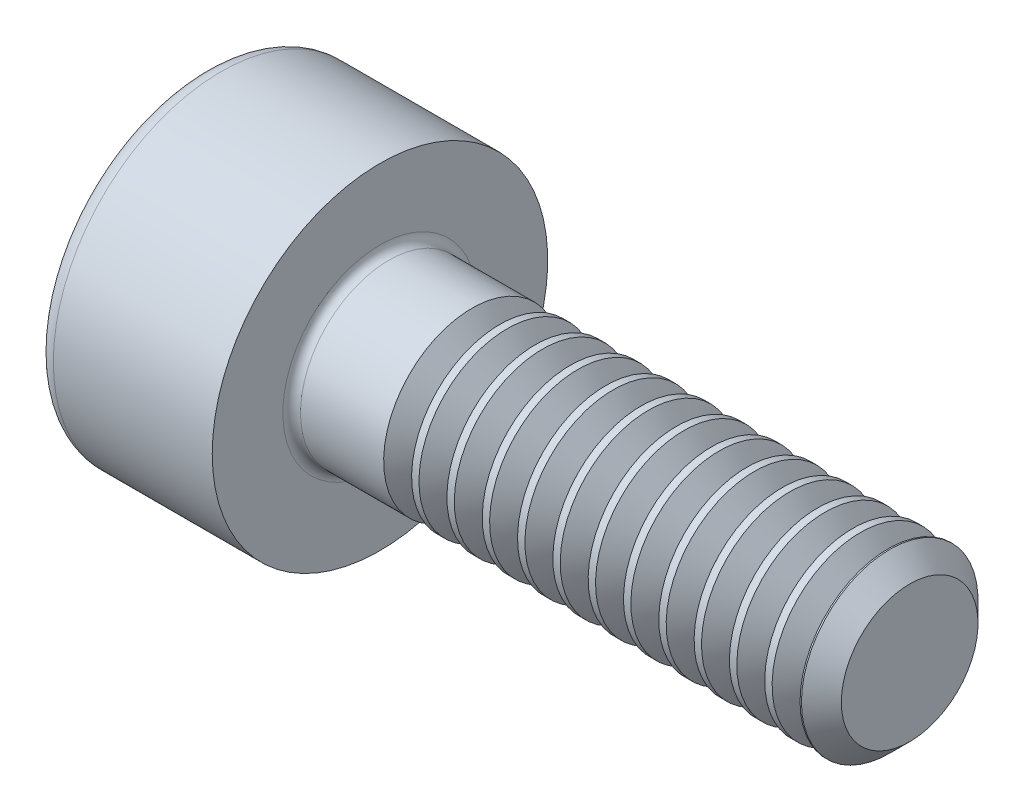
ISO-10303-21;
HEADER;
FILE_DESCRIPTION(('STEP AP214'),'2;1');
FILE_NAME('part.step','',(''),(''),'','','');
FILE_SCHEMA(('AUTOMOTIVE_DESIGN { 1 0 10303 214 1 1 1 1 }'));
ENDSEC;
DATA;
#1=APPLICATION_CONTEXT('core data for automotive mechanical design processes');
#2=APPLICATION_PROTOCOL_DEFINITION('international standard','automotive_design',2000,#1);
#3=PRODUCT_CONTEXT('',#1,'mechanical');
#4=PRODUCT('Part','Part','',(#3));
#5=PRODUCT_RELATED_PRODUCT_CATEGORY('part','',(#4));
#6=PRODUCT_DEFINITION_FORMATION('','',#4);
#7=PRODUCT_DEFINITION_CONTEXT('part definition',#1,'design');
#8=PRODUCT_DEFINITION('design','',#6,#7);
#9=PRODUCT_DEFINITION_SHAPE('','',#8);
#10=(LENGTH_UNIT() NAMED_UNIT(*) SI_UNIT(.MILLI.,.METRE.));
#11=(NAMED_UNIT(*) PLANE_ANGLE_UNIT() SI_UNIT($,.RADIAN.));
#12=(NAMED_UNIT(*) SI_UNIT($,.STERADIAN.) SOLID_ANGLE_UNIT());
#13=UNCERTAINTY_MEASURE_WITH_UNIT(LENGTH_MEASURE(1.E-05),#10,'distance_accuracy_value','');
#14=(GEOMETRIC_REPRESENTATION_CONTEXT(3) GLOBAL_UNCERTAINTY_ASSIGNED_CONTEXT((#13)) GLOBAL_UNIT_ASSIGNED_CONTEXT((#10,
#11,#12)) REPRESENTATION_CONTEXT('',''));
#15=CARTESIAN_POINT('',(0.,0.,0.));
#16=DIRECTION('',(0.,0.,1.));
#17=DIRECTION('',(1.,0.,0.));
#18=AXIS2_PLACEMENT_3D('',#15,#16,#17);
#19=CARTESIAN_POINT('',(0.,0.,0.));
#20=DIRECTION('',(-1.,0.,0.));
#21=DIRECTION('',(0.,0.,1.));
#22=AXIS2_PLACEMENT_3D('',#19,#20,#21);
#23=PLANE('',#22);
#24=DIRECTION('',(0.,-0.499999999999999,0.866025403784439));
#25=VECTOR('',#24,1.);
#26=CARTESIAN_POINT('',(0.,0.877572409168226,0.));
#27=LINE('',#26,#25);
#28=CARTESIAN_POINT('',(0.,0.877572409168226,0.));
#29=VERTEX_POINT('',#28);
#30=CARTESIAN_POINT('',(0.,0.438786204584111,0.759999999999997));
#31=VERTEX_POINT('',#30);
#32=EDGE_CURVE('E444',#29,#31,#27,.T.);
#33=ORIENTED_EDGE('',*,*,#32,.T.);
#34=DIRECTION('',(0.,1.,0.));
#35=VECTOR('',#34,1.);
#36=CARTESIAN_POINT('',(0.,-0.43878620458412,0.759999999999999));
#37=LINE('',#36,#35);
#38=CARTESIAN_POINT('',(0.,-0.43878620458412,0.759999999999999));
#39=VERTEX_POINT('',#38);
#40=EDGE_CURVE('E131',#39,#31,#37,.T.);
#41=ORIENTED_EDGE('',*,*,#40,.F.);
#42=DIRECTION('',(0.,-0.500000000000001,-0.866025403784438));
#43=VECTOR('',#42,1.);
#44=CARTESIAN_POINT('',(0.,-0.43878620458412,0.759999999999999));
#45=LINE('',#44,#43);
#46=CARTESIAN_POINT('',(0.,-0.877572409168237,0.));
#47=VERTEX_POINT('',#46);
#48=EDGE_CURVE('E463',#39,#47,#45,.T.);
#49=ORIENTED_EDGE('',*,*,#48,.T.);
#50=DIRECTION('',(0.,0.499999999999999,-0.866025403784439));
#51=VECTOR('',#50,1.);
#52=CARTESIAN_POINT('',(0.,-0.877572409168237,0.));
#53=LINE('',#52,#51);
#54=CARTESIAN_POINT('',(0.,-0.438786204584122,-0.760000000000002));
#55=VERTEX_POINT('',#54);
#56=EDGE_CURVE('E466',#47,#55,#53,.T.);
#57=ORIENTED_EDGE('',*,*,#56,.T.);
#58=DIRECTION('',(0.,-1.,0.));
#59=VECTOR('',#58,1.);
#60=CARTESIAN_POINT('',(0.,0.43878620458411,-0.760000000000003));
#61=LINE('',#60,#59);
#62=CARTESIAN_POINT('',(0.,0.43878620458411,-0.760000000000003));
#63=VERTEX_POINT('',#62);
#64=EDGE_CURVE('E469',#63,#55,#61,.T.);
#65=ORIENTED_EDGE('',*,*,#64,.F.);
#66=DIRECTION('',(0.,-0.500000000000001,-0.866025403784438));
#67=VECTOR('',#66,1.);
#68=CARTESIAN_POINT('',(0.,0.877572409168226,0.));
#69=LINE('',#68,#67);
#70=EDGE_CURVE('E126',#29,#63,#69,.T.);
#71=ORIENTED_EDGE('',*,*,#70,.F.);
#72=EDGE_LOOP('',(#33,#41,#49,#57,#65,#71));
#73=FACE_BOUND('',#72,.T.);
#74=CARTESIAN_POINT('',(0.,0.,0.));
#75=DIRECTION('',(-1.,0.,0.));
#76=DIRECTION('',(0.,0.,1.));
#77=AXIS2_PLACEMENT_3D('',#74,#75,#76);
#78=CIRCLE('',#77,1.7);
#79=CARTESIAN_POINT('',(0.,0.,1.7));
#80=VERTEX_POINT('',#79);
#81=EDGE_CURVE('E43',#80,#80,#78,.T.);
#82=ORIENTED_EDGE('',*,*,#81,.T.);
#83=EDGE_LOOP('',(#82));
#84=FACE_BOUND('',#83,.T.);
#85=ADVANCED_FACE('F35',(#73,#84),#23,.T.);
#86=CARTESIAN_POINT('',(-31.75,0.,0.));
#87=DIRECTION('',(-1.,0.,0.));
#88=DIRECTION('',(0.,0.,1.));
#89=AXIS2_PLACEMENT_3D('',#86,#87,#88);
#90=CYLINDRICAL_SURFACE('',#89,1.9);
#91=CARTESIAN_POINT('',(0.199999999999999,0.,0.));
#92=DIRECTION('',(-1.,0.,0.));
#93=DIRECTION('',(0.,0.,1.));
#94=AXIS2_PLACEMENT_3D('',#91,#92,#93);
#95=CIRCLE('',#94,1.9);
#96=CARTESIAN_POINT('',(0.199999999999999,0.,1.9));
#97=VERTEX_POINT('',#96);
#98=EDGE_CURVE('E11',#97,#97,#95,.F.);
#99=ORIENTED_EDGE('',*,*,#98,.T.);
#100=EDGE_LOOP('',(#99));
#101=FACE_BOUND('',#100,.T.);
#102=CARTESIAN_POINT('',(2.,0.,0.));
#103=DIRECTION('',(-1.,0.,0.));
#104=DIRECTION('',(0.,0.,1.));
#105=AXIS2_PLACEMENT_3D('',#102,#103,#104);
#106=CIRCLE('',#105,1.9);
#107=CARTESIAN_POINT('',(2.,0.,1.9));
#108=VERTEX_POINT('',#107);
#109=EDGE_CURVE('E149',#108,#108,#106,.T.);
#110=ORIENTED_EDGE('',*,*,#109,.T.);
#111=EDGE_LOOP('',(#110));
#112=FACE_BOUND('',#111,.T.);
#113=ADVANCED_FACE('F173',(#101,#112),#90,.T.);
#114=CARTESIAN_POINT('',(2.,1.9,0.));
#115=DIRECTION('',(1.,0.,0.));
#116=DIRECTION('',(0.,0.,-1.));
#117=AXIS2_PLACEMENT_3D('',#114,#115,#116);
#118=PLANE('',#117);
#119=CARTESIAN_POINT('',(2.,0.,0.));
#120=DIRECTION('',(1.,0.,0.));
#121=DIRECTION('',(0.,0.,-1.));
#122=AXIS2_PLACEMENT_3D('',#119,#120,#121);
#123=CIRCLE('',#122,1.1);
#124=CARTESIAN_POINT('',(2.,0.,-1.1));
#125=VERTEX_POINT('',#124);
#126=EDGE_CURVE('E152',#125,#125,#123,.F.);
#127=ORIENTED_EDGE('',*,*,#126,.T.);
#128=EDGE_LOOP('',(#127));
#129=FACE_BOUND('',#128,.T.);
#130=ORIENTED_EDGE('',*,*,#109,.F.);
#131=EDGE_LOOP('',(#130));
#132=FACE_BOUND('',#131,.T.);
#133=ADVANCED_FACE('F179',(#129,#132),#118,.T.);
#134=CARTESIAN_POINT('',(-31.75,0.,0.));
#135=DIRECTION('',(-1.,0.,0.));
#136=DIRECTION('',(0.,0.,1.));
#137=AXIS2_PLACEMENT_3D('',#134,#135,#136);
#138=CYLINDRICAL_SURFACE('',#137,0.999999999999997);
#139=CARTESIAN_POINT('',(3.0417530963646,0.,0.));
#140=DIRECTION('',(-1.,0.,0.));
#141=DIRECTION('',(0.,-1.,0.));
#142=AXIS2_PLACEMENT_3D('',#139,#140,#141);
#143=CIRCLE('',#142,1.);
#144=CARTESIAN_POINT('',(3.0417530963646,-1.,0.));
#145=VERTEX_POINT('',#144);
#146=EDGE_CURVE('E439',#145,#145,#143,.T.);
#147=ORIENTED_EDGE('',*,*,#146,.T.);
#148=EDGE_LOOP('',(#147));
#149=FACE_BOUND('',#148,.T.);
#150=CARTESIAN_POINT('',(2.1,0.,0.));
#151=DIRECTION('',(1.,0.,0.));
#152=DIRECTION('',(0.,0.,-1.));
#153=AXIS2_PLACEMENT_3D('',#150,#151,#152);
#154=CIRCLE('',#153,0.999999999999997);
#155=CARTESIAN_POINT('',(2.1,0.,-0.999999999999997));
#156=VERTEX_POINT('',#155);
#157=EDGE_CURVE('E155',#156,#156,#154,.T.);
#158=ORIENTED_EDGE('',*,*,#157,.T.);
#159=EDGE_LOOP('',(#158));
#160=FACE_BOUND('',#159,.T.);
#161=ADVANCED_FACE('F169',(#149,#160),#138,.T.);
#162=CARTESIAN_POINT('',(2.1,0.,0.));
#163=DIRECTION('',(1.,0.,0.));
#164=DIRECTION('',(0.,0.,-1.));
#165=AXIS2_PLACEMENT_3D('',#162,#163,#164);
#166=TOROIDAL_SURFACE('',#165,1.1,0.1);
#167=ORIENTED_EDGE('',*,*,#157,.F.);
#168=EDGE_LOOP('',(#167));
#169=FACE_BOUND('',#168,.T.);
#170=ORIENTED_EDGE('',*,*,#126,.F.);
#171=EDGE_LOOP('',(#170));
#172=FACE_BOUND('',#171,.T.);
#173=ADVANCED_FACE('F162',(#169,#172),#166,.F.);
#174=CARTESIAN_POINT('',(0.199999999999999,0.,0.));
#175=DIRECTION('',(-1.,0.,0.));
#176=DIRECTION('',(0.,0.,1.));
#177=AXIS2_PLACEMENT_3D('',#174,#175,#176);
#178=TOROIDAL_SURFACE('',#177,1.7,0.2);
#179=ORIENTED_EDGE('',*,*,#98,.F.);
#180=EDGE_LOOP('',(#179));
#181=FACE_BOUND('',#180,.T.);
#182=ORIENTED_EDGE('',*,*,#81,.F.);
#183=EDGE_LOOP('',(#182));
#184=FACE_BOUND('',#183,.T.);
#185=ADVANCED_FACE('F37',(#181,#184),#178,.T.);
#186=CARTESIAN_POINT('',(1.,0.877572409168226,0.));
#187=DIRECTION('',(0.,-0.866025403784439,-0.499999999999999));
#188=DIRECTION('',(0.,0.499999999999999,-0.866025403784439));
#189=AXIS2_PLACEMENT_3D('',#186,#187,#188);
#190=PLANE('',#189);
#191=ORIENTED_EDGE('',*,*,#32,.F.);
#192=DIRECTION('',(-1.,0.,0.));
#193=VECTOR('',#192,1.);
#194=CARTESIAN_POINT('',(1.,0.877572409168226,0.));
#195=LINE('',#194,#193);
#196=CARTESIAN_POINT('',(1.,0.877572409168226,0.));
#197=VERTEX_POINT('',#196);
#198=EDGE_CURVE('E460',#197,#29,#195,.T.);
#199=ORIENTED_EDGE('',*,*,#198,.F.);
#200=DIRECTION('',(0.,-0.499999999999999,0.866025403784439));
#201=VECTOR('',#200,1.);
#202=CARTESIAN_POINT('',(1.,0.877572409168226,0.));
#203=LINE('',#202,#201);
#204=CARTESIAN_POINT('',(1.,0.658179306876169,0.379999999999997));
#205=VERTEX_POINT('',#204);
#206=EDGE_CURVE('E118',#197,#205,#203,.T.);
#207=ORIENTED_EDGE('',*,*,#206,.T.);
#208=CARTESIAN_POINT('',(1.,0.438786204584111,0.759999999999997));
#209=VERTEX_POINT('',#208);
#210=EDGE_CURVE('E109',#205,#209,#203,.T.);
#211=ORIENTED_EDGE('',*,*,#210,.T.);
#212=DIRECTION('',(-1.,0.,0.));
#213=VECTOR('',#212,1.);
#214=CARTESIAN_POINT('',(1.,0.438786204584111,0.759999999999997));
#215=LINE('',#214,#213);
#216=EDGE_CURVE('E123',#209,#31,#215,.T.);
#217=ORIENTED_EDGE('',*,*,#216,.T.);
#218=EDGE_LOOP('',(#191,#199,#207,#211,#217));
#219=FACE_BOUND('',#218,.T.);
#220=ADVANCED_FACE('F122',(#219),#190,.T.);
#221=CARTESIAN_POINT('',(1.,-0.43878620458412,0.759999999999999));
#222=DIRECTION('',(0.,0.,1.));
#223=DIRECTION('',(0.,-1.,0.));
#224=AXIS2_PLACEMENT_3D('',#221,#222,#223);
#225=PLANE('',#224);
#226=ORIENTED_EDGE('',*,*,#40,.T.);
#227=ORIENTED_EDGE('',*,*,#216,.F.);
#228=DIRECTION('',(0.,1.,0.));
#229=VECTOR('',#228,1.);
#230=CARTESIAN_POINT('',(1.,-0.43878620458412,0.759999999999999));
#231=LINE('',#230,#229);
#232=CARTESIAN_POINT('',(1.,0.,0.759999999999998));
#233=VERTEX_POINT('',#232);
#234=EDGE_CURVE('E106',#233,#209,#231,.T.);
#235=ORIENTED_EDGE('',*,*,#234,.F.);
#236=CARTESIAN_POINT('',(1.,-0.43878620458412,0.759999999999999));
#237=VERTEX_POINT('',#236);
#238=EDGE_CURVE('E117',#237,#233,#231,.T.);
#239=ORIENTED_EDGE('',*,*,#238,.F.);
#240=DIRECTION('',(-1.,0.,0.));
#241=VECTOR('',#240,1.);
#242=CARTESIAN_POINT('',(1.,-0.43878620458412,0.759999999999999));
#243=LINE('',#242,#241);
#244=EDGE_CURVE('E133',#237,#39,#243,.T.);
#245=ORIENTED_EDGE('',*,*,#244,.T.);
#246=EDGE_LOOP('',(#226,#227,#235,#239,#245));
#247=FACE_BOUND('',#246,.T.);
#248=ADVANCED_FACE('F128',(#247),#225,.F.);
#249=CARTESIAN_POINT('',(1.,-0.43878620458412,0.759999999999999));
#250=DIRECTION('',(0.,0.866025403784438,-0.500000000000001));
#251=DIRECTION('',(0.,0.500000000000001,0.866025403784438));
#252=AXIS2_PLACEMENT_3D('',#249,#250,#251);
#253=PLANE('',#252);
#254=ORIENTED_EDGE('',*,*,#48,.F.);
#255=ORIENTED_EDGE('',*,*,#244,.F.);
#256=DIRECTION('',(0.,-0.500000000000001,-0.866025403784438));
#257=VECTOR('',#256,1.);
#258=CARTESIAN_POINT('',(1.,-0.43878620458412,0.759999999999999));
#259=LINE('',#258,#257);
#260=CARTESIAN_POINT('',(1.,-0.658179306876176,0.380000000000003));
#261=VERTEX_POINT('',#260);
#262=EDGE_CURVE('E447',#237,#261,#259,.T.);
#263=ORIENTED_EDGE('',*,*,#262,.T.);
#264=CARTESIAN_POINT('',(1.,-0.877572409168237,0.));
#265=VERTEX_POINT('',#264);
#266=EDGE_CURVE('E446',#261,#265,#259,.T.);
#267=ORIENTED_EDGE('',*,*,#266,.T.);
#268=DIRECTION('',(-1.,0.,0.));
#269=VECTOR('',#268,1.);
#270=CARTESIAN_POINT('',(1.,-0.877572409168237,0.));
#271=LINE('',#270,#269);
#272=EDGE_CURVE('E138',#265,#47,#271,.T.);
#273=ORIENTED_EDGE('',*,*,#272,.T.);
#274=EDGE_LOOP('',(#254,#255,#263,#267,#273));
#275=FACE_BOUND('',#274,.T.);
#276=ADVANCED_FACE('F207',(#275),#253,.T.);
#277=CARTESIAN_POINT('',(1.,-0.877572409168237,0.));
#278=DIRECTION('',(0.,0.866025403784439,0.499999999999999));
#279=DIRECTION('',(0.,-0.499999999999999,0.866025403784439));
#280=AXIS2_PLACEMENT_3D('',#277,#278,#279);
#281=PLANE('',#280);
#282=ORIENTED_EDGE('',*,*,#56,.F.);
#283=ORIENTED_EDGE('',*,*,#272,.F.);
#284=DIRECTION('',(0.,0.499999999999999,-0.866025403784439));
#285=VECTOR('',#284,1.);
#286=CARTESIAN_POINT('',(1.,-0.877572409168237,0.));
#287=LINE('',#286,#285);
#288=CARTESIAN_POINT('',(1.,-0.658179306876179,-0.380000000000002));
#289=VERTEX_POINT('',#288);
#290=EDGE_CURVE('E451',#265,#289,#287,.T.);
#291=ORIENTED_EDGE('',*,*,#290,.T.);
#292=CARTESIAN_POINT('',(1.,-0.438786204584122,-0.760000000000002));
#293=VERTEX_POINT('',#292);
#294=EDGE_CURVE('E450',#289,#293,#287,.T.);
#295=ORIENTED_EDGE('',*,*,#294,.T.);
#296=DIRECTION('',(-1.,0.,0.));
#297=VECTOR('',#296,1.);
#298=CARTESIAN_POINT('',(1.,-0.438786204584122,-0.760000000000002));
#299=LINE('',#298,#297);
#300=EDGE_CURVE('E478',#293,#55,#299,.T.);
#301=ORIENTED_EDGE('',*,*,#300,.T.);
#302=EDGE_LOOP('',(#282,#283,#291,#295,#301));
#303=FACE_BOUND('',#302,.T.);
#304=ADVANCED_FACE('F210',(#303),#281,.T.);
#305=CARTESIAN_POINT('',(1.,0.43878620458411,-0.760000000000003));
#306=DIRECTION('',(0.,0.,-1.));
#307=DIRECTION('',(0.,1.,0.));
#308=AXIS2_PLACEMENT_3D('',#305,#306,#307);
#309=PLANE('',#308);
#310=ORIENTED_EDGE('',*,*,#64,.T.);
#311=ORIENTED_EDGE('',*,*,#300,.F.);
#312=DIRECTION('',(0.,-1.,0.));
#313=VECTOR('',#312,1.);
#314=CARTESIAN_POINT('',(1.,0.43878620458411,-0.760000000000003));
#315=LINE('',#314,#313);
#316=CARTESIAN_POINT('',(1.,0.,-0.76));
#317=VERTEX_POINT('',#316);
#318=EDGE_CURVE('E454',#317,#293,#315,.T.);
#319=ORIENTED_EDGE('',*,*,#318,.F.);
#320=CARTESIAN_POINT('',(1.,0.43878620458411,-0.760000000000003));
#321=VERTEX_POINT('',#320);
#322=EDGE_CURVE('E50',#321,#317,#315,.T.);
#323=ORIENTED_EDGE('',*,*,#322,.F.);
#324=DIRECTION('',(-1.,0.,0.));
#325=VECTOR('',#324,1.);
#326=CARTESIAN_POINT('',(1.,0.43878620458411,-0.760000000000003));
#327=LINE('',#326,#325);
#328=EDGE_CURVE('E475',#321,#63,#327,.T.);
#329=ORIENTED_EDGE('',*,*,#328,.T.);
#330=EDGE_LOOP('',(#310,#311,#319,#323,#329));
#331=FACE_BOUND('',#330,.T.);
#332=ADVANCED_FACE('F214',(#331),#309,.F.);
#333=CARTESIAN_POINT('',(1.,0.877572409168226,0.));
#334=DIRECTION('',(0.,0.866025403784438,-0.500000000000001));
#335=DIRECTION('',(0.,0.500000000000001,0.866025403784438));
#336=AXIS2_PLACEMENT_3D('',#333,#334,#335);
#337=PLANE('',#336);
#338=ORIENTED_EDGE('',*,*,#70,.T.);
#339=ORIENTED_EDGE('',*,*,#328,.F.);
#340=DIRECTION('',(0.,-0.500000000000001,-0.866025403784438));
#341=VECTOR('',#340,1.);
#342=CARTESIAN_POINT('',(1.,0.877572409168226,0.));
#343=LINE('',#342,#341);
#344=CARTESIAN_POINT('',(1.,0.65817930687617,-0.379999999999999));
#345=VERTEX_POINT('',#344);
#346=EDGE_CURVE('E456',#345,#321,#343,.T.);
#347=ORIENTED_EDGE('',*,*,#346,.F.);
#348=EDGE_CURVE('E457',#197,#345,#343,.T.);
#349=ORIENTED_EDGE('',*,*,#348,.F.);
#350=ORIENTED_EDGE('',*,*,#198,.T.);
#351=EDGE_LOOP('',(#338,#339,#347,#349,#350));
#352=FACE_BOUND('',#351,.T.);
#353=ADVANCED_FACE('F218',(#352),#337,.F.);
#354=CARTESIAN_POINT('',(1.,0.,1.52));
#355=DIRECTION('',(1.,0.,0.));
#356=DIRECTION('',(0.,0.,-1.));
#357=AXIS2_PLACEMENT_3D('',#354,#355,#356);
#358=PLANE('',#357);
#359=ORIENTED_EDGE('',*,*,#318,.T.);
#360=ORIENTED_EDGE('',*,*,#294,.F.);
#361=CARTESIAN_POINT('',(1.,0.,0.));
#362=DIRECTION('',(-1.,0.,0.));
#363=DIRECTION('',(0.,0.,1.));
#364=AXIS2_PLACEMENT_3D('',#361,#362,#363);
#365=CIRCLE('',#364,0.76);
#366=EDGE_CURVE('E495',#317,#289,#365,.T.);
#367=ORIENTED_EDGE('',*,*,#366,.F.);
#368=EDGE_LOOP('',(#359,#360,#367));
#369=FACE_BOUND('',#368,.T.);
#370=ADVANCED_FACE('F222',(#369),#358,.F.);
#371=ORIENTED_EDGE('',*,*,#290,.F.);
#372=ORIENTED_EDGE('',*,*,#266,.F.);
#373=EDGE_CURVE('E136',#289,#261,#365,.T.);
#374=ORIENTED_EDGE('',*,*,#373,.F.);
#375=EDGE_LOOP('',(#371,#372,#374));
#376=FACE_BOUND('',#375,.T.);
#377=ADVANCED_FACE('F226',(#376),#358,.F.);
#378=ORIENTED_EDGE('',*,*,#262,.F.);
#379=ORIENTED_EDGE('',*,*,#238,.T.);
#380=EDGE_CURVE('E132',#261,#233,#365,.T.);
#381=ORIENTED_EDGE('',*,*,#380,.F.);
#382=EDGE_LOOP('',(#378,#379,#381));
#383=FACE_BOUND('',#382,.T.);
#384=ADVANCED_FACE('F504',(#383),#358,.F.);
#385=ORIENTED_EDGE('',*,*,#234,.T.);
#386=ORIENTED_EDGE('',*,*,#210,.F.);
#387=EDGE_CURVE('E112',#233,#205,#365,.T.);
#388=ORIENTED_EDGE('',*,*,#387,.F.);
#389=EDGE_LOOP('',(#385,#386,#388));
#390=FACE_BOUND('',#389,.T.);
#391=ADVANCED_FACE('F108',(#390),#358,.F.);
#392=ORIENTED_EDGE('',*,*,#206,.F.);
#393=ORIENTED_EDGE('',*,*,#348,.T.);
#394=EDGE_CURVE('E143',#205,#345,#365,.T.);
#395=ORIENTED_EDGE('',*,*,#394,.F.);
#396=EDGE_LOOP('',(#392,#393,#395));
#397=FACE_BOUND('',#396,.T.);
#398=ADVANCED_FACE('F490',(#397),#358,.F.);
#399=ORIENTED_EDGE('',*,*,#346,.T.);
#400=ORIENTED_EDGE('',*,*,#322,.T.);
#401=EDGE_CURVE('E494',#345,#317,#365,.T.);
#402=ORIENTED_EDGE('',*,*,#401,.F.);
#403=EDGE_LOOP('',(#399,#400,#402));
#404=FACE_BOUND('',#403,.T.);
#405=ADVANCED_FACE('F203',(#404),#358,.F.);
#406=CARTESIAN_POINT('',(1.,0.,0.));
#407=DIRECTION('',(-1.,0.,0.));
#408=DIRECTION('',(0.,0.,1.));
#409=AXIS2_PLACEMENT_3D('',#406,#407,#408);
#410=CONICAL_SURFACE('',#409,0.76,1.0471975511966);
#411=CARTESIAN_POINT('',(1.43878620458412,0.,0.));
#412=VERTEX_POINT('',#411);
#413=VERTEX_LOOP('',#412);
#414=FACE_BOUND('',#413,.T.);
#415=ORIENTED_EDGE('',*,*,#387,.T.);
#416=ORIENTED_EDGE('',*,*,#394,.T.);
#417=ORIENTED_EDGE('',*,*,#401,.T.);
#418=ORIENTED_EDGE('',*,*,#366,.T.);
#419=ORIENTED_EDGE('',*,*,#373,.T.);
#420=ORIENTED_EDGE('',*,*,#380,.T.);
#421=EDGE_LOOP('',(#415,#416,#417,#418,#419,#420));
#422=FACE_BOUND('',#421,.T.);
#423=ADVANCED_FACE('F200',(#414,#422),#410,.F.);
#424=CARTESIAN_POINT('',(3.35824690363539,0.,0.));
#425=DIRECTION('',(1.,0.,0.));
#426=DIRECTION('',(0.,1.,0.));
#427=AXIS2_PLACEMENT_3D('',#424,#425,#426);
#428=CONICAL_SURFACE('',#427,1.,0.959931088596883);
#429=CARTESIAN_POINT('',(3.2,0.,0.));
#430=DIRECTION('',(-1.,0.,0.));
#431=DIRECTION('',(0.,-1.,0.));
#432=AXIS2_PLACEMENT_3D('',#429,#430,#431);
#433=CIRCLE('',#432,0.774000000000001);
#434=CARTESIAN_POINT('',(3.2,-0.774,0.));
#435=VERTEX_POINT('',#434);
#436=EDGE_CURVE('E436',#435,#435,#433,.T.);
#437=ORIENTED_EDGE('',*,*,#436,.F.);
#438=EDGE_LOOP('',(#437));
#439=FACE_BOUND('',#438,.T.);
#440=CARTESIAN_POINT('',(3.35824690363539,0.,0.));
#441=DIRECTION('',(-1.,0.,0.));
#442=DIRECTION('',(0.,-1.,0.));
#443=AXIS2_PLACEMENT_3D('',#440,#441,#442);
#444=CIRCLE('',#443,1.);
#445=CARTESIAN_POINT('',(3.35824690363539,-1.,0.));
#446=VERTEX_POINT('',#445);
#447=EDGE_CURVE('E442',#446,#446,#444,.T.);
#448=ORIENTED_EDGE('',*,*,#447,.T.);
#449=EDGE_LOOP('',(#448));
#450=FACE_BOUND('',#449,.T.);
#451=ADVANCED_FACE('F202',(#439,#450),#428,.T.);
#452=CARTESIAN_POINT('',(3.2,0.,0.));
#453=DIRECTION('',(-1.,0.,0.));
#454=DIRECTION('',(0.,-1.,0.));
#455=AXIS2_PLACEMENT_3D('',#452,#453,#454);
#456=CONICAL_SURFACE('',#455,0.774000000000001,0.959931088596878);
#457=ORIENTED_EDGE('',*,*,#146,.F.);
#458=EDGE_LOOP('',(#457));
#459=FACE_BOUND('',#458,.T.);
#460=ORIENTED_EDGE('',*,*,#436,.T.);
#461=EDGE_LOOP('',(#460));
#462=FACE_BOUND('',#461,.T.);
#463=ADVANCED_FACE('F230',(#459,#462),#456,.T.);
#464=CARTESIAN_POINT('',(3.4417530963646,0.,0.));
#465=DIRECTION('',(-1.,0.,0.));
#466=DIRECTION('',(0.,-1.,0.));
#467=AXIS2_PLACEMENT_3D('',#464,#465,#466);
#468=CIRCLE('',#467,1.);
#469=CARTESIAN_POINT('',(3.4417530963646,-1.,0.));
#470=VERTEX_POINT('',#469);
#471=EDGE_CURVE('E430',#470,#470,#468,.T.);
#472=ORIENTED_EDGE('',*,*,#471,.T.);
#473=EDGE_LOOP('',(#472));
#474=FACE_BOUND('',#473,.T.);
#475=ORIENTED_EDGE('',*,*,#447,.F.);
#476=EDGE_LOOP('',(#475));
#477=FACE_BOUND('',#476,.T.);
#478=ADVANCED_FACE('F190',(#474,#477),#138,.T.);
#479=CARTESIAN_POINT('',(3.75824690363539,0.,0.));
#480=DIRECTION('',(1.,0.,0.));
#481=DIRECTION('',(0.,1.,0.));
#482=AXIS2_PLACEMENT_3D('',#479,#480,#481);
#483=CONICAL_SURFACE('',#482,1.,0.959931088596883);
#484=CARTESIAN_POINT('',(3.6,0.,0.));
#485=DIRECTION('',(-1.,0.,0.));
#486=DIRECTION('',(0.,-1.,0.));
#487=AXIS2_PLACEMENT_3D('',#484,#485,#486);
#488=CIRCLE('',#487,0.774000000000001);
#489=CARTESIAN_POINT('',(3.6,-0.774,0.));
#490=VERTEX_POINT('',#489);
#491=EDGE_CURVE('E427',#490,#490,#488,.T.);
#492=ORIENTED_EDGE('',*,*,#491,.F.);
#493=EDGE_LOOP('',(#492));
#494=FACE_BOUND('',#493,.T.);
#495=CARTESIAN_POINT('',(3.75824690363539,0.,0.));
#496=DIRECTION('',(-1.,0.,0.));
#497=DIRECTION('',(0.,-1.,0.));
#498=AXIS2_PLACEMENT_3D('',#495,#496,#497);
#499=CIRCLE('',#498,1.);
#500=CARTESIAN_POINT('',(3.75824690363539,-1.,0.));
#501=VERTEX_POINT('',#500);
#502=EDGE_CURVE('E433',#501,#501,#499,.T.);
#503=ORIENTED_EDGE('',*,*,#502,.T.);
#504=EDGE_LOOP('',(#503));
#505=FACE_BOUND('',#504,.T.);
#506=ADVANCED_FACE('F235',(#494,#505),#483,.T.);
#507=CARTESIAN_POINT('',(3.6,0.,0.));
#508=DIRECTION('',(-1.,0.,0.));
#509=DIRECTION('',(0.,-1.,0.));
#510=AXIS2_PLACEMENT_3D('',#507,#508,#509);
#511=CONICAL_SURFACE('',#510,0.774000000000001,0.959931088596878);
#512=ORIENTED_EDGE('',*,*,#471,.F.);
#513=EDGE_LOOP('',(#512));
#514=FACE_BOUND('',#513,.T.);
#515=ORIENTED_EDGE('',*,*,#491,.T.);
#516=EDGE_LOOP('',(#515));
#517=FACE_BOUND('',#516,.T.);
#518=ADVANCED_FACE('F238',(#514,#517),#511,.T.);
#519=CARTESIAN_POINT('',(3.8417530963646,0.,0.));
#520=DIRECTION('',(-1.,0.,0.));
#521=DIRECTION('',(0.,-1.,0.));
#522=AXIS2_PLACEMENT_3D('',#519,#520,#521);
#523=CIRCLE('',#522,1.);
#524=CARTESIAN_POINT('',(3.8417530963646,-1.,0.));
#525=VERTEX_POINT('',#524);
#526=EDGE_CURVE('E421',#525,#525,#523,.T.);
#527=ORIENTED_EDGE('',*,*,#526,.T.);
#528=EDGE_LOOP('',(#527));
#529=FACE_BOUND('',#528,.T.);
#530=ORIENTED_EDGE('',*,*,#502,.F.);
#531=EDGE_LOOP('',(#530));
#532=FACE_BOUND('',#531,.T.);
#533=ADVANCED_FACE('F242',(#529,#532),#138,.T.);
#534=CARTESIAN_POINT('',(4.15824690363539,0.,0.));
#535=DIRECTION('',(1.,0.,0.));
#536=DIRECTION('',(0.,1.,0.));
#537=AXIS2_PLACEMENT_3D('',#534,#535,#536);
#538=CONICAL_SURFACE('',#537,1.,0.959931088596883);
#539=CARTESIAN_POINT('',(4.,0.,0.));
#540=DIRECTION('',(-1.,0.,0.));
#541=DIRECTION('',(0.,-1.,0.));
#542=AXIS2_PLACEMENT_3D('',#539,#540,#541);
#543=CIRCLE('',#542,0.774000000000001);
#544=CARTESIAN_POINT('',(4.,-0.774,0.));
#545=VERTEX_POINT('',#544);
#546=EDGE_CURVE('E418',#545,#545,#543,.T.);
#547=ORIENTED_EDGE('',*,*,#546,.F.);
#548=EDGE_LOOP('',(#547));
#549=FACE_BOUND('',#548,.T.);
#550=CARTESIAN_POINT('',(4.15824690363539,0.,0.));
#551=DIRECTION('',(-1.,0.,0.));
#552=DIRECTION('',(0.,-1.,0.));
#553=AXIS2_PLACEMENT_3D('',#550,#551,#552);
#554=CIRCLE('',#553,1.);
#555=CARTESIAN_POINT('',(4.15824690363539,-1.,0.));
#556=VERTEX_POINT('',#555);
#557=EDGE_CURVE('E424',#556,#556,#554,.T.);
#558=ORIENTED_EDGE('',*,*,#557,.T.);
#559=EDGE_LOOP('',(#558));
#560=FACE_BOUND('',#559,.T.);
#561=ADVANCED_FACE('F244',(#549,#560),#538,.T.);
#562=CARTESIAN_POINT('',(4.,0.,0.));
#563=DIRECTION('',(-1.,0.,0.));
#564=DIRECTION('',(0.,-1.,0.));
#565=AXIS2_PLACEMENT_3D('',#562,#563,#564);
#566=CONICAL_SURFACE('',#565,0.774000000000001,0.959931088596878);
#567=ORIENTED_EDGE('',*,*,#526,.F.);
#568=EDGE_LOOP('',(#567));
#569=FACE_BOUND('',#568,.T.);
#570=ORIENTED_EDGE('',*,*,#546,.T.);
#571=EDGE_LOOP('',(#570));
#572=FACE_BOUND('',#571,.T.);
#573=ADVANCED_FACE('F247',(#569,#572),#566,.T.);
#574=CARTESIAN_POINT('',(4.2417530963646,0.,0.));
#575=DIRECTION('',(-1.,0.,0.));
#576=DIRECTION('',(0.,-1.,0.));
#577=AXIS2_PLACEMENT_3D('',#574,#575,#576);
#578=CIRCLE('',#577,1.);
#579=CARTESIAN_POINT('',(4.2417530963646,-1.,0.));
#580=VERTEX_POINT('',#579);
#581=EDGE_CURVE('E412',#580,#580,#578,.T.);
#582=ORIENTED_EDGE('',*,*,#581,.T.);
#583=EDGE_LOOP('',(#582));
#584=FACE_BOUND('',#583,.T.);
#585=ORIENTED_EDGE('',*,*,#557,.F.);
#586=EDGE_LOOP('',(#585));
#587=FACE_BOUND('',#586,.T.);
#588=ADVANCED_FACE('F251',(#584,#587),#138,.T.);
#589=CARTESIAN_POINT('',(4.55824690363539,0.,0.));
#590=DIRECTION('',(1.,0.,0.));
#591=DIRECTION('',(0.,1.,0.));
#592=AXIS2_PLACEMENT_3D('',#589,#590,#591);
#593=CONICAL_SURFACE('',#592,1.,0.959931088596883);
#594=CARTESIAN_POINT('',(4.4,0.,0.));
#595=DIRECTION('',(-1.,0.,0.));
#596=DIRECTION('',(0.,-1.,0.));
#597=AXIS2_PLACEMENT_3D('',#594,#595,#596);
#598=CIRCLE('',#597,0.774000000000001);
#599=CARTESIAN_POINT('',(4.4,-0.774,0.));
#600=VERTEX_POINT('',#599);
#601=EDGE_CURVE('E409',#600,#600,#598,.T.);
#602=ORIENTED_EDGE('',*,*,#601,.F.);
#603=EDGE_LOOP('',(#602));
#604=FACE_BOUND('',#603,.T.);
#605=CARTESIAN_POINT('',(4.55824690363539,0.,0.));
#606=DIRECTION('',(-1.,0.,0.));
#607=DIRECTION('',(0.,-1.,0.));
#608=AXIS2_PLACEMENT_3D('',#605,#606,#607);
#609=CIRCLE('',#608,1.);
#610=CARTESIAN_POINT('',(4.55824690363539,-1.,0.));
#611=VERTEX_POINT('',#610);
#612=EDGE_CURVE('E415',#611,#611,#609,.T.);
#613=ORIENTED_EDGE('',*,*,#612,.T.);
#614=EDGE_LOOP('',(#613));
#615=FACE_BOUND('',#614,.T.);
#616=ADVANCED_FACE('F253',(#604,#615),#593,.T.);
#617=CARTESIAN_POINT('',(4.4,0.,0.));
#618=DIRECTION('',(-1.,0.,0.));
#619=DIRECTION('',(0.,-1.,0.));
#620=AXIS2_PLACEMENT_3D('',#617,#618,#619);
#621=CONICAL_SURFACE('',#620,0.774000000000001,0.959931088596878);
#622=ORIENTED_EDGE('',*,*,#581,.F.);
#623=EDGE_LOOP('',(#622));
#624=FACE_BOUND('',#623,.T.);
#625=ORIENTED_EDGE('',*,*,#601,.T.);
#626=EDGE_LOOP('',(#625));
#627=FACE_BOUND('',#626,.T.);
#628=ADVANCED_FACE('F256',(#624,#627),#621,.T.);
#629=CARTESIAN_POINT('',(4.6417530963646,0.,0.));
#630=DIRECTION('',(-1.,0.,0.));
#631=DIRECTION('',(0.,-1.,0.));
#632=AXIS2_PLACEMENT_3D('',#629,#630,#631);
#633=CIRCLE('',#632,1.);
#634=CARTESIAN_POINT('',(4.6417530963646,-1.,0.));
#635=VERTEX_POINT('',#634);
#636=EDGE_CURVE('E403',#635,#635,#633,.T.);
#637=ORIENTED_EDGE('',*,*,#636,.T.);
#638=EDGE_LOOP('',(#637));
#639=FACE_BOUND('',#638,.T.);
#640=ORIENTED_EDGE('',*,*,#612,.F.);
#641=EDGE_LOOP('',(#640));
#642=FACE_BOUND('',#641,.T.);
#643=ADVANCED_FACE('F260',(#639,#642),#138,.T.);
#644=CARTESIAN_POINT('',(4.95824690363539,0.,0.));
#645=DIRECTION('',(1.,0.,0.));
#646=DIRECTION('',(0.,1.,0.));
#647=AXIS2_PLACEMENT_3D('',#644,#645,#646);
#648=CONICAL_SURFACE('',#647,1.,0.959931088596883);
#649=CARTESIAN_POINT('',(4.8,0.,0.));
#650=DIRECTION('',(-1.,0.,0.));
#651=DIRECTION('',(0.,-1.,0.));
#652=AXIS2_PLACEMENT_3D('',#649,#650,#651);
#653=CIRCLE('',#652,0.774000000000001);
#654=CARTESIAN_POINT('',(4.8,-0.774,0.));
#655=VERTEX_POINT('',#654);
#656=EDGE_CURVE('E400',#655,#655,#653,.T.);
#657=ORIENTED_EDGE('',*,*,#656,.F.);
#658=EDGE_LOOP('',(#657));
#659=FACE_BOUND('',#658,.T.);
#660=CARTESIAN_POINT('',(4.95824690363539,0.,0.));
#661=DIRECTION('',(-1.,0.,0.));
#662=DIRECTION('',(0.,-1.,0.));
#663=AXIS2_PLACEMENT_3D('',#660,#661,#662);
#664=CIRCLE('',#663,1.);
#665=CARTESIAN_POINT('',(4.95824690363539,-1.,0.));
#666=VERTEX_POINT('',#665);
#667=EDGE_CURVE('E406',#666,#666,#664,.T.);
#668=ORIENTED_EDGE('',*,*,#667,.T.);
#669=EDGE_LOOP('',(#668));
#670=FACE_BOUND('',#669,.T.);
#671=ADVANCED_FACE('F262',(#659,#670),#648,.T.);
#672=CARTESIAN_POINT('',(4.8,0.,0.));
#673=DIRECTION('',(-1.,0.,0.));
#674=DIRECTION('',(0.,-1.,0.));
#675=AXIS2_PLACEMENT_3D('',#672,#673,#674);
#676=CONICAL_SURFACE('',#675,0.774000000000001,0.959931088596878);
#677=ORIENTED_EDGE('',*,*,#636,.F.);
#678=EDGE_LOOP('',(#677));
#679=FACE_BOUND('',#678,.T.);
#680=ORIENTED_EDGE('',*,*,#656,.T.);
#681=EDGE_LOOP('',(#680));
#682=FACE_BOUND('',#681,.T.);
#683=ADVANCED_FACE('F265',(#679,#682),#676,.T.);
#684=CARTESIAN_POINT('',(5.0417530963646,0.,0.));
#685=DIRECTION('',(-1.,0.,0.));
#686=DIRECTION('',(0.,-1.,0.));
#687=AXIS2_PLACEMENT_3D('',#684,#685,#686);
#688=CIRCLE('',#687,1.);
#689=CARTESIAN_POINT('',(5.0417530963646,-1.,0.));
#690=VERTEX_POINT('',#689);
#691=EDGE_CURVE('E394',#690,#690,#688,.T.);
#692=ORIENTED_EDGE('',*,*,#691,.T.);
#693=EDGE_LOOP('',(#692));
#694=FACE_BOUND('',#693,.T.);
#695=ORIENTED_EDGE('',*,*,#667,.F.);
#696=EDGE_LOOP('',(#695));
#697=FACE_BOUND('',#696,.T.);
#698=ADVANCED_FACE('F269',(#694,#697),#138,.T.);
#699=CARTESIAN_POINT('',(5.35824690363539,0.,0.));
#700=DIRECTION('',(1.,0.,0.));
#701=DIRECTION('',(0.,1.,0.));
#702=AXIS2_PLACEMENT_3D('',#699,#700,#701);
#703=CONICAL_SURFACE('',#702,1.,0.959931088596883);
#704=CARTESIAN_POINT('',(5.2,0.,0.));
#705=DIRECTION('',(-1.,0.,0.));
#706=DIRECTION('',(0.,-1.,0.));
#707=AXIS2_PLACEMENT_3D('',#704,#705,#706);
#708=CIRCLE('',#707,0.774000000000001);
#709=CARTESIAN_POINT('',(5.2,-0.774,0.));
#710=VERTEX_POINT('',#709);
#711=EDGE_CURVE('E391',#710,#710,#708,.T.);
#712=ORIENTED_EDGE('',*,*,#711,.F.);
#713=EDGE_LOOP('',(#712));
#714=FACE_BOUND('',#713,.T.);
#715=CARTESIAN_POINT('',(5.35824690363539,0.,0.));
#716=DIRECTION('',(-1.,0.,0.));
#717=DIRECTION('',(0.,-1.,0.));
#718=AXIS2_PLACEMENT_3D('',#715,#716,#717);
#719=CIRCLE('',#718,1.);
#720=CARTESIAN_POINT('',(5.35824690363539,-1.,0.));
#721=VERTEX_POINT('',#720);
#722=EDGE_CURVE('E397',#721,#721,#719,.T.);
#723=ORIENTED_EDGE('',*,*,#722,.T.);
#724=EDGE_LOOP('',(#723));
#725=FACE_BOUND('',#724,.T.);
#726=ADVANCED_FACE('F271',(#714,#725),#703,.T.);
#727=CARTESIAN_POINT('',(5.2,0.,0.));
#728=DIRECTION('',(-1.,0.,0.));
#729=DIRECTION('',(0.,-1.,0.));
#730=AXIS2_PLACEMENT_3D('',#727,#728,#729);
#731=CONICAL_SURFACE('',#730,0.774000000000001,0.959931088596878);
#732=ORIENTED_EDGE('',*,*,#691,.F.);
#733=EDGE_LOOP('',(#732));
#734=FACE_BOUND('',#733,.T.);
#735=ORIENTED_EDGE('',*,*,#711,.T.);
#736=EDGE_LOOP('',(#735));
#737=FACE_BOUND('',#736,.T.);
#738=ADVANCED_FACE('F274',(#734,#737),#731,.T.);
#739=CARTESIAN_POINT('',(5.4417530963646,0.,0.));
#740=DIRECTION('',(-1.,0.,0.));
#741=DIRECTION('',(0.,-1.,0.));
#742=AXIS2_PLACEMENT_3D('',#739,#740,#741);
#743=CIRCLE('',#742,1.);
#744=CARTESIAN_POINT('',(5.4417530963646,-1.,0.));
#745=VERTEX_POINT('',#744);
#746=EDGE_CURVE('E385',#745,#745,#743,.T.);
#747=ORIENTED_EDGE('',*,*,#746,.T.);
#748=EDGE_LOOP('',(#747));
#749=FACE_BOUND('',#748,.T.);
#750=ORIENTED_EDGE('',*,*,#722,.F.);
#751=EDGE_LOOP('',(#750));
#752=FACE_BOUND('',#751,.T.);
#753=ADVANCED_FACE('F278',(#749,#752),#138,.T.);
#754=CARTESIAN_POINT('',(5.75824690363539,0.,0.));
#755=DIRECTION('',(1.,0.,0.));
#756=DIRECTION('',(0.,1.,0.));
#757=AXIS2_PLACEMENT_3D('',#754,#755,#756);
#758=CONICAL_SURFACE('',#757,1.,0.959931088596883);
#759=CARTESIAN_POINT('',(5.6,0.,0.));
#760=DIRECTION('',(-1.,0.,0.));
#761=DIRECTION('',(0.,-1.,0.));
#762=AXIS2_PLACEMENT_3D('',#759,#760,#761);
#763=CIRCLE('',#762,0.774000000000001);
#764=CARTESIAN_POINT('',(5.6,-0.774,0.));
#765=VERTEX_POINT('',#764);
#766=EDGE_CURVE('E382',#765,#765,#763,.T.);
#767=ORIENTED_EDGE('',*,*,#766,.F.);
#768=EDGE_LOOP('',(#767));
#769=FACE_BOUND('',#768,.T.);
#770=CARTESIAN_POINT('',(5.75824690363539,0.,0.));
#771=DIRECTION('',(-1.,0.,0.));
#772=DIRECTION('',(0.,-1.,0.));
#773=AXIS2_PLACEMENT_3D('',#770,#771,#772);
#774=CIRCLE('',#773,1.);
#775=CARTESIAN_POINT('',(5.75824690363539,-1.,0.));
#776=VERTEX_POINT('',#775);
#777=EDGE_CURVE('E388',#776,#776,#774,.T.);
#778=ORIENTED_EDGE('',*,*,#777,.T.);
#779=EDGE_LOOP('',(#778));
#780=FACE_BOUND('',#779,.T.);
#781=ADVANCED_FACE('F280',(#769,#780),#758,.T.);
#782=CARTESIAN_POINT('',(5.6,0.,0.));
#783=DIRECTION('',(-1.,0.,0.));
#784=DIRECTION('',(0.,-1.,0.));
#785=AXIS2_PLACEMENT_3D('',#782,#783,#784);
#786=CONICAL_SURFACE('',#785,0.774000000000001,0.959931088596878);
#787=ORIENTED_EDGE('',*,*,#746,.F.);
#788=EDGE_LOOP('',(#787));
#789=FACE_BOUND('',#788,.T.);
#790=ORIENTED_EDGE('',*,*,#766,.T.);
#791=EDGE_LOOP('',(#790));
#792=FACE_BOUND('',#791,.T.);
#793=ADVANCED_FACE('F283',(#789,#792),#786,.T.);
#794=CARTESIAN_POINT('',(5.8417530963646,0.,0.));
#795=DIRECTION('',(-1.,0.,0.));
#796=DIRECTION('',(0.,-1.,0.));
#797=AXIS2_PLACEMENT_3D('',#794,#795,#796);
#798=CIRCLE('',#797,1.);
#799=CARTESIAN_POINT('',(5.8417530963646,-1.,0.));
#800=VERTEX_POINT('',#799);
#801=EDGE_CURVE('E376',#800,#800,#798,.T.);
#802=ORIENTED_EDGE('',*,*,#801,.T.);
#803=EDGE_LOOP('',(#802));
#804=FACE_BOUND('',#803,.T.);
#805=ORIENTED_EDGE('',*,*,#777,.F.);
#806=EDGE_LOOP('',(#805));
#807=FACE_BOUND('',#806,.T.);
#808=ADVANCED_FACE('F287',(#804,#807),#138,.T.);
#809=CARTESIAN_POINT('',(6.15824690363539,0.,0.));
#810=DIRECTION('',(1.,0.,0.));
#811=DIRECTION('',(0.,1.,0.));
#812=AXIS2_PLACEMENT_3D('',#809,#810,#811);
#813=CONICAL_SURFACE('',#812,1.,0.959931088596883);
#814=CARTESIAN_POINT('',(6.,0.,0.));
#815=DIRECTION('',(-1.,0.,0.));
#816=DIRECTION('',(0.,-1.,0.));
#817=AXIS2_PLACEMENT_3D('',#814,#815,#816);
#818=CIRCLE('',#817,0.774000000000001);
#819=CARTESIAN_POINT('',(6.,-0.774,0.));
#820=VERTEX_POINT('',#819);
#821=EDGE_CURVE('E373',#820,#820,#818,.T.);
#822=ORIENTED_EDGE('',*,*,#821,.F.);
#823=EDGE_LOOP('',(#822));
#824=FACE_BOUND('',#823,.T.);
#825=CARTESIAN_POINT('',(6.15824690363539,0.,0.));
#826=DIRECTION('',(-1.,0.,0.));
#827=DIRECTION('',(0.,-1.,0.));
#828=AXIS2_PLACEMENT_3D('',#825,#826,#827);
#829=CIRCLE('',#828,1.);
#830=CARTESIAN_POINT('',(6.15824690363539,-1.,0.));
#831=VERTEX_POINT('',#830);
#832=EDGE_CURVE('E379',#831,#831,#829,.T.);
#833=ORIENTED_EDGE('',*,*,#832,.T.);
#834=EDGE_LOOP('',(#833));
#835=FACE_BOUND('',#834,.T.);
#836=ADVANCED_FACE('F289',(#824,#835),#813,.T.);
#837=CARTESIAN_POINT('',(6.,0.,0.));
#838=DIRECTION('',(-1.,0.,0.));
#839=DIRECTION('',(0.,-1.,0.));
#840=AXIS2_PLACEMENT_3D('',#837,#838,#839);
#841=CONICAL_SURFACE('',#840,0.774000000000001,0.959931088596878);
#842=ORIENTED_EDGE('',*,*,#801,.F.);
#843=EDGE_LOOP('',(#842));
#844=FACE_BOUND('',#843,.T.);
#845=ORIENTED_EDGE('',*,*,#821,.T.);
#846=EDGE_LOOP('',(#845));
#847=FACE_BOUND('',#846,.T.);
#848=ADVANCED_FACE('F292',(#844,#847),#841,.T.);
#849=CARTESIAN_POINT('',(6.2417530963646,0.,0.));
#850=DIRECTION('',(-1.,0.,0.));
#851=DIRECTION('',(0.,-1.,0.));
#852=AXIS2_PLACEMENT_3D('',#849,#850,#851);
#853=CIRCLE('',#852,1.);
#854=CARTESIAN_POINT('',(6.2417530963646,-1.,0.));
#855=VERTEX_POINT('',#854);
#856=EDGE_CURVE('E367',#855,#855,#853,.T.);
#857=ORIENTED_EDGE('',*,*,#856,.T.);
#858=EDGE_LOOP('',(#857));
#859=FACE_BOUND('',#858,.T.);
#860=ORIENTED_EDGE('',*,*,#832,.F.);
#861=EDGE_LOOP('',(#860));
#862=FACE_BOUND('',#861,.T.);
#863=ADVANCED_FACE('F296',(#859,#862),#138,.T.);
#864=CARTESIAN_POINT('',(6.55824690363539,0.,0.));
#865=DIRECTION('',(1.,0.,0.));
#866=DIRECTION('',(0.,1.,0.));
#867=AXIS2_PLACEMENT_3D('',#864,#865,#866);
#868=CONICAL_SURFACE('',#867,1.,0.959931088596883);
#869=CARTESIAN_POINT('',(6.4,0.,0.));
#870=DIRECTION('',(-1.,0.,0.));
#871=DIRECTION('',(0.,-1.,0.));
#872=AXIS2_PLACEMENT_3D('',#869,#870,#871);
#873=CIRCLE('',#872,0.774000000000001);
#874=CARTESIAN_POINT('',(6.4,-0.774,0.));
#875=VERTEX_POINT('',#874);
#876=EDGE_CURVE('E364',#875,#875,#873,.T.);
#877=ORIENTED_EDGE('',*,*,#876,.F.);
#878=EDGE_LOOP('',(#877));
#879=FACE_BOUND('',#878,.T.);
#880=CARTESIAN_POINT('',(6.55824690363539,0.,0.));
#881=DIRECTION('',(-1.,0.,0.));
#882=DIRECTION('',(0.,-1.,0.));
#883=AXIS2_PLACEMENT_3D('',#880,#881,#882);
#884=CIRCLE('',#883,1.);
#885=CARTESIAN_POINT('',(6.55824690363539,-1.,0.));
#886=VERTEX_POINT('',#885);
#887=EDGE_CURVE('E370',#886,#886,#884,.T.);
#888=ORIENTED_EDGE('',*,*,#887,.T.);
#889=EDGE_LOOP('',(#888));
#890=FACE_BOUND('',#889,.T.);
#891=ADVANCED_FACE('F298',(#879,#890),#868,.T.);
#892=CARTESIAN_POINT('',(6.4,0.,0.));
#893=DIRECTION('',(-1.,0.,0.));
#894=DIRECTION('',(0.,-1.,0.));
#895=AXIS2_PLACEMENT_3D('',#892,#893,#894);
#896=CONICAL_SURFACE('',#895,0.774000000000001,0.959931088596878);
#897=ORIENTED_EDGE('',*,*,#856,.F.);
#898=EDGE_LOOP('',(#897));
#899=FACE_BOUND('',#898,.T.);
#900=ORIENTED_EDGE('',*,*,#876,.T.);
#901=EDGE_LOOP('',(#900));
#902=FACE_BOUND('',#901,.T.);
#903=ADVANCED_FACE('F301',(#899,#902),#896,.T.);
#904=CARTESIAN_POINT('',(6.6417530963646,0.,0.));
#905=DIRECTION('',(-1.,0.,0.));
#906=DIRECTION('',(0.,-1.,0.));
#907=AXIS2_PLACEMENT_3D('',#904,#905,#906);
#908=CIRCLE('',#907,1.);
#909=CARTESIAN_POINT('',(6.6417530963646,-1.,0.));
#910=VERTEX_POINT('',#909);
#911=EDGE_CURVE('E358',#910,#910,#908,.T.);
#912=ORIENTED_EDGE('',*,*,#911,.T.);
#913=EDGE_LOOP('',(#912));
#914=FACE_BOUND('',#913,.T.);
#915=ORIENTED_EDGE('',*,*,#887,.F.);
#916=EDGE_LOOP('',(#915));
#917=FACE_BOUND('',#916,.T.);
#918=ADVANCED_FACE('F305',(#914,#917),#138,.T.);
#919=CARTESIAN_POINT('',(6.95824690363539,0.,0.));
#920=DIRECTION('',(1.,0.,0.));
#921=DIRECTION('',(0.,1.,0.));
#922=AXIS2_PLACEMENT_3D('',#919,#920,#921);
#923=CONICAL_SURFACE('',#922,1.,0.959931088596883);
#924=CARTESIAN_POINT('',(6.8,0.,0.));
#925=DIRECTION('',(-1.,0.,0.));
#926=DIRECTION('',(0.,-1.,0.));
#927=AXIS2_PLACEMENT_3D('',#924,#925,#926);
#928=CIRCLE('',#927,0.774000000000001);
#929=CARTESIAN_POINT('',(6.8,-0.774,0.));
#930=VERTEX_POINT('',#929);
#931=EDGE_CURVE('E355',#930,#930,#928,.T.);
#932=ORIENTED_EDGE('',*,*,#931,.F.);
#933=EDGE_LOOP('',(#932));
#934=FACE_BOUND('',#933,.T.);
#935=CARTESIAN_POINT('',(6.95824690363539,0.,0.));
#936=DIRECTION('',(-1.,0.,0.));
#937=DIRECTION('',(0.,-1.,0.));
#938=AXIS2_PLACEMENT_3D('',#935,#936,#937);
#939=CIRCLE('',#938,1.);
#940=CARTESIAN_POINT('',(6.95824690363539,-1.,0.));
#941=VERTEX_POINT('',#940);
#942=EDGE_CURVE('E361',#941,#941,#939,.T.);
#943=ORIENTED_EDGE('',*,*,#942,.T.);
#944=EDGE_LOOP('',(#943));
#945=FACE_BOUND('',#944,.T.);
#946=ADVANCED_FACE('F307',(#934,#945),#923,.T.);
#947=CARTESIAN_POINT('',(6.8,0.,0.));
#948=DIRECTION('',(-1.,0.,0.));
#949=DIRECTION('',(0.,-1.,0.));
#950=AXIS2_PLACEMENT_3D('',#947,#948,#949);
#951=CONICAL_SURFACE('',#950,0.774000000000001,0.959931088596878);
#952=ORIENTED_EDGE('',*,*,#911,.F.);
#953=EDGE_LOOP('',(#952));
#954=FACE_BOUND('',#953,.T.);
#955=ORIENTED_EDGE('',*,*,#931,.T.);
#956=EDGE_LOOP('',(#955));
#957=FACE_BOUND('',#956,.T.);
#958=ADVANCED_FACE('F310',(#954,#957),#951,.T.);
#959=CARTESIAN_POINT('',(7.0417530963646,0.,0.));
#960=DIRECTION('',(-1.,0.,0.));
#961=DIRECTION('',(0.,-1.,0.));
#962=AXIS2_PLACEMENT_3D('',#959,#960,#961);
#963=CIRCLE('',#962,1.);
#964=CARTESIAN_POINT('',(7.0417530963646,-1.,0.));
#965=VERTEX_POINT('',#964);
#966=EDGE_CURVE('E349',#965,#965,#963,.T.);
#967=ORIENTED_EDGE('',*,*,#966,.T.);
#968=EDGE_LOOP('',(#967));
#969=FACE_BOUND('',#968,.T.);
#970=ORIENTED_EDGE('',*,*,#942,.F.);
#971=EDGE_LOOP('',(#970));
#972=FACE_BOUND('',#971,.T.);
#973=ADVANCED_FACE('F314',(#969,#972),#138,.T.);
#974=CARTESIAN_POINT('',(7.35824690363539,0.,0.));
#975=DIRECTION('',(1.,0.,0.));
#976=DIRECTION('',(0.,1.,0.));
#977=AXIS2_PLACEMENT_3D('',#974,#975,#976);
#978=CONICAL_SURFACE('',#977,1.,0.959931088596883);
#979=CARTESIAN_POINT('',(7.2,0.,0.));
#980=DIRECTION('',(-1.,0.,0.));
#981=DIRECTION('',(0.,-1.,0.));
#982=AXIS2_PLACEMENT_3D('',#979,#980,#981);
#983=CIRCLE('',#982,0.774000000000001);
#984=CARTESIAN_POINT('',(7.2,-0.774,0.));
#985=VERTEX_POINT('',#984);
#986=EDGE_CURVE('E346',#985,#985,#983,.T.);
#987=ORIENTED_EDGE('',*,*,#986,.F.);
#988=EDGE_LOOP('',(#987));
#989=FACE_BOUND('',#988,.T.);
#990=CARTESIAN_POINT('',(7.35824690363539,0.,0.));
#991=DIRECTION('',(-1.,0.,0.));
#992=DIRECTION('',(0.,-1.,0.));
#993=AXIS2_PLACEMENT_3D('',#990,#991,#992);
#994=CIRCLE('',#993,1.);
#995=CARTESIAN_POINT('',(7.35824690363539,-1.,0.));
#996=VERTEX_POINT('',#995);
#997=EDGE_CURVE('E352',#996,#996,#994,.T.);
#998=ORIENTED_EDGE('',*,*,#997,.T.);
#999=EDGE_LOOP('',(#998));
#1000=FACE_BOUND('',#999,.T.);
#1001=ADVANCED_FACE('F316',(#989,#1000),#978,.T.);
#1002=CARTESIAN_POINT('',(7.2,0.,0.));
#1003=DIRECTION('',(-1.,0.,0.));
#1004=DIRECTION('',(0.,-1.,0.));
#1005=AXIS2_PLACEMENT_3D('',#1002,#1003,#1004);
#1006=CONICAL_SURFACE('',#1005,0.774000000000001,0.959931088596878);
#1007=ORIENTED_EDGE('',*,*,#966,.F.);
#1008=EDGE_LOOP('',(#1007));
#1009=FACE_BOUND('',#1008,.T.);
#1010=ORIENTED_EDGE('',*,*,#986,.T.);
#1011=EDGE_LOOP('',(#1010));
#1012=FACE_BOUND('',#1011,.T.);
#1013=ADVANCED_FACE('F319',(#1009,#1012),#1006,.T.);
#1014=CARTESIAN_POINT('',(7.4417530963646,0.,0.));
#1015=DIRECTION('',(-1.,0.,0.));
#1016=DIRECTION('',(0.,-1.,0.));
#1017=AXIS2_PLACEMENT_3D('',#1014,#1015,#1016);
#1018=CIRCLE('',#1017,1.);
#1019=CARTESIAN_POINT('',(7.4417530963646,-1.,0.));
#1020=VERTEX_POINT('',#1019);
#1021=EDGE_CURVE('E336',#1020,#1020,#1018,.T.);
#1022=ORIENTED_EDGE('',*,*,#1021,.T.);
#1023=EDGE_LOOP('',(#1022));
#1024=FACE_BOUND('',#1023,.T.);
#1025=ORIENTED_EDGE('',*,*,#997,.F.);
#1026=EDGE_LOOP('',(#1025));
#1027=FACE_BOUND('',#1026,.T.);
#1028=ADVANCED_FACE('F323',(#1024,#1027),#138,.T.);
#1029=CARTESIAN_POINT('',(7.75824690363539,0.,0.));
#1030=DIRECTION('',(1.,0.,0.));
#1031=DIRECTION('',(0.,1.,0.));
#1032=AXIS2_PLACEMENT_3D('',#1029,#1030,#1031);
#1033=CONICAL_SURFACE('',#1032,1.,0.959931088596883);
#1034=CARTESIAN_POINT('',(7.6,0.,0.));
#1035=DIRECTION('',(-1.,0.,0.));
#1036=DIRECTION('',(0.,-1.,0.));
#1037=AXIS2_PLACEMENT_3D('',#1034,#1035,#1036);
#1038=CIRCLE('',#1037,0.774000000000001);
#1039=CARTESIAN_POINT('',(7.6,-0.774,0.));
#1040=VERTEX_POINT('',#1039);
#1041=EDGE_CURVE('E339',#1040,#1040,#1038,.T.);
#1042=ORIENTED_EDGE('',*,*,#1041,.F.);
#1043=EDGE_LOOP('',(#1042));
#1044=FACE_BOUND('',#1043,.T.);
#1045=CARTESIAN_POINT('',(7.75824690363539,0.,0.));
#1046=DIRECTION('',(-1.,0.,0.));
#1047=DIRECTION('',(0.,-1.,0.));
#1048=AXIS2_PLACEMENT_3D('',#1045,#1046,#1047);
#1049=CIRCLE('',#1048,1.);
#1050=CARTESIAN_POINT('',(7.75824690363539,-1.,0.));
#1051=VERTEX_POINT('',#1050);
#1052=EDGE_CURVE('E341',#1051,#1051,#1049,.T.);
#1053=ORIENTED_EDGE('',*,*,#1052,.T.);
#1054=EDGE_LOOP('',(#1053));
#1055=FACE_BOUND('',#1054,.T.);
#1056=ADVANCED_FACE('F325',(#1044,#1055),#1033,.T.);
#1057=CARTESIAN_POINT('',(7.6,0.,0.));
#1058=DIRECTION('',(-1.,0.,0.));
#1059=DIRECTION('',(0.,-1.,0.));
#1060=AXIS2_PLACEMENT_3D('',#1057,#1058,#1059);
#1061=CONICAL_SURFACE('',#1060,0.774000000000001,0.959931088596878);
#1062=ORIENTED_EDGE('',*,*,#1021,.F.);
#1063=EDGE_LOOP('',(#1062));
#1064=FACE_BOUND('',#1063,.T.);
#1065=ORIENTED_EDGE('',*,*,#1041,.T.);
#1066=EDGE_LOOP('',(#1065));
#1067=FACE_BOUND('',#1066,.T.);
#1068=ADVANCED_FACE('F198',(#1064,#1067),#1061,.T.);
#1069=CARTESIAN_POINT('',(8.,0.774,0.));
#1070=DIRECTION('',(1.,0.,0.));
#1071=DIRECTION('',(0.,0.,-1.));
#1072=AXIS2_PLACEMENT_3D('',#1069,#1070,#1071);
#1073=PLANE('',#1072);
#1074=CARTESIAN_POINT('',(8.,0.,0.));
#1075=DIRECTION('',(-1.,0.,0.));
#1076=DIRECTION('',(0.,0.,1.));
#1077=AXIS2_PLACEMENT_3D('',#1074,#1075,#1076);
#1078=CIRCLE('',#1077,0.774);
#1079=CARTESIAN_POINT('',(8.,0.,0.774));
#1080=VERTEX_POINT('',#1079);
#1081=EDGE_CURVE('E142',#1080,#1080,#1078,.T.);
#1082=ORIENTED_EDGE('',*,*,#1081,.F.);
#1083=EDGE_LOOP('',(#1082));
#1084=FACE_BOUND('',#1083,.T.);
#1085=ADVANCED_FACE('F194',(#1084),#1073,.T.);
#1086=CARTESIAN_POINT('',(8.,0.,0.));
#1087=DIRECTION('',(-1.,0.,0.));
#1088=DIRECTION('',(0.,0.,1.));
#1089=AXIS2_PLACEMENT_3D('',#1086,#1087,#1088);
#1090=CONICAL_SURFACE('',#1089,0.774,0.785398163397428);
#1091=CARTESIAN_POINT('',(7.774,0.,0.));
#1092=DIRECTION('',(-1.,0.,0.));
#1093=DIRECTION('',(0.,0.,1.));
#1094=AXIS2_PLACEMENT_3D('',#1091,#1092,#1093);
#1095=CIRCLE('',#1094,0.999999999999995);
#1096=CARTESIAN_POINT('',(7.774,0.,0.999999999999995));
#1097=VERTEX_POINT('',#1096);
#1098=EDGE_CURVE('E146',#1097,#1097,#1095,.T.);
#1099=ORIENTED_EDGE('',*,*,#1098,.F.);
#1100=EDGE_LOOP('',(#1099));
#1101=FACE_BOUND('',#1100,.T.);
#1102=ORIENTED_EDGE('',*,*,#1081,.T.);
#1103=EDGE_LOOP('',(#1102));
#1104=FACE_BOUND('',#1103,.T.);
#1105=ADVANCED_FACE('F191',(#1101,#1104),#1090,.T.);
#1106=ORIENTED_EDGE('',*,*,#1052,.F.);
#1107=EDGE_LOOP('',(#1106));
#1108=FACE_BOUND('',#1107,.T.);
#1109=ORIENTED_EDGE('',*,*,#1098,.T.);
#1110=EDGE_LOOP('',(#1109));
#1111=FACE_BOUND('',#1110,.T.);
#1112=ADVANCED_FACE('F189',(#1108,#1111),#138,.T.);
#1113=CLOSED_SHELL('',(#85,#113,#133,#161,#173,#185,#220,#248,#276,#304,#332,#353,#370,#377,
#384,#391,#398,#405,#423,#451,#463,#478,#506,#518,#533,#561,#573,#588,#616,#628,#643,#671,#683,
#698,#726,#738,#753,#781,#793,#808,#836,#848,#863,#891,#903,#918,#946,#958,#973,#1001,#1013,
#1028,#1056,#1068,#1085,#1105,#1112));
#1114=MANIFOLD_SOLID_BREP('B2',#1113);
#1115=ADVANCED_BREP_SHAPE_REPRESENTATION('',(#18,#1114),#14);
#1116=SHAPE_DEFINITION_REPRESENTATION(#9,#1115);
ENDSEC;
END-ISO-10303-21;
